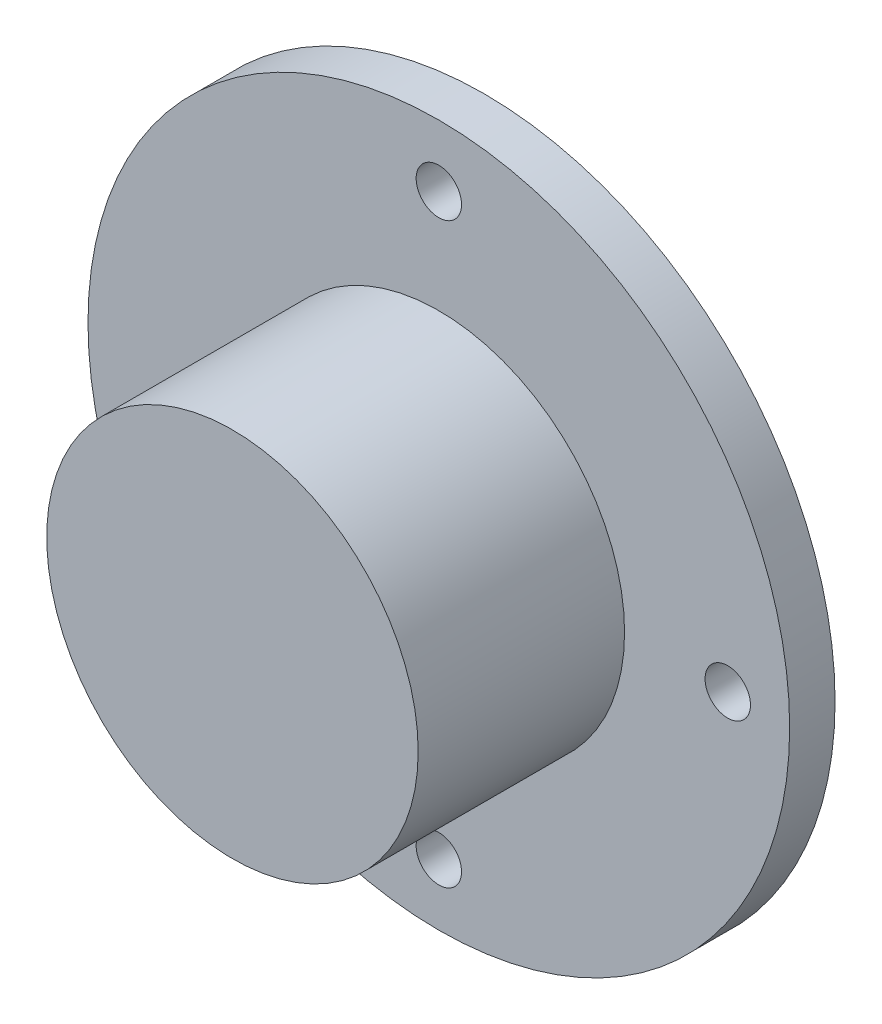
ISO-10303-21;
HEADER;
FILE_DESCRIPTION(('STEP AP214'),'2;1');
FILE_NAME('part.step','',(''),(''),'','','');
FILE_SCHEMA(('AUTOMOTIVE_DESIGN { 1 0 10303 214 1 1 1 1 }'));
ENDSEC;
DATA;
#1=APPLICATION_CONTEXT('core data for automotive mechanical design processes');
#2=APPLICATION_PROTOCOL_DEFINITION('international standard','automotive_design',2000,#1);
#3=PRODUCT_CONTEXT('',#1,'mechanical');
#4=PRODUCT('Part','Part','',(#3));
#5=PRODUCT_RELATED_PRODUCT_CATEGORY('part','',(#4));
#6=PRODUCT_DEFINITION_FORMATION('','',#4);
#7=PRODUCT_DEFINITION_CONTEXT('part definition',#1,'design');
#8=PRODUCT_DEFINITION('design','',#6,#7);
#9=PRODUCT_DEFINITION_SHAPE('','',#8);
#10=(LENGTH_UNIT() NAMED_UNIT(*) SI_UNIT(.MILLI.,.METRE.));
#11=(NAMED_UNIT(*) PLANE_ANGLE_UNIT() SI_UNIT($,.RADIAN.));
#12=(NAMED_UNIT(*) SI_UNIT($,.STERADIAN.) SOLID_ANGLE_UNIT());
#13=UNCERTAINTY_MEASURE_WITH_UNIT(LENGTH_MEASURE(1.E-05),#10,'distance_accuracy_value','');
#14=(GEOMETRIC_REPRESENTATION_CONTEXT(3) GLOBAL_UNCERTAINTY_ASSIGNED_CONTEXT((#13)) GLOBAL_UNIT_ASSIGNED_CONTEXT((#10,
#11,#12)) REPRESENTATION_CONTEXT('',''));
#15=CARTESIAN_POINT('',(0.,0.,0.));
#16=DIRECTION('',(0.,0.,1.));
#17=DIRECTION('',(1.,0.,0.));
#18=AXIS2_PLACEMENT_3D('',#15,#16,#17);
#19=CARTESIAN_POINT('',(0.,0.,2.));
#20=DIRECTION('',(0.,0.,-1.));
#21=DIRECTION('',(-1.,0.,0.));
#22=AXIS2_PLACEMENT_3D('',#19,#20,#21);
#23=CYLINDRICAL_SURFACE('',#22,17.);
#24=CARTESIAN_POINT('',(0.,0.,2.));
#25=DIRECTION('',(0.,0.,1.));
#26=DIRECTION('',(1.,0.,0.));
#27=AXIS2_PLACEMENT_3D('',#24,#25,#26);
#28=CIRCLE('',#27,17.);
#29=CARTESIAN_POINT('',(17.,0.,2.));
#30=VERTEX_POINT('',#29);
#31=EDGE_CURVE('E51',#30,#30,#28,.T.);
#32=ORIENTED_EDGE('',*,*,#31,.F.);
#33=EDGE_LOOP('',(#32));
#34=FACE_BOUND('',#33,.T.);
#35=CARTESIAN_POINT('',(0.,0.,-0.2));
#36=DIRECTION('',(0.,0.,1.));
#37=DIRECTION('',(1.,0.,0.));
#38=AXIS2_PLACEMENT_3D('',#35,#36,#37);
#39=CIRCLE('',#38,17.);
#40=CARTESIAN_POINT('',(17.,0.,-0.2));
#41=VERTEX_POINT('',#40);
#42=EDGE_CURVE('E60',#41,#41,#39,.T.);
#43=ORIENTED_EDGE('',*,*,#42,.T.);
#44=EDGE_LOOP('',(#43));
#45=FACE_BOUND('',#44,.T.);
#46=ADVANCED_FACE('F43',(#34,#45),#23,.T.);
#47=CARTESIAN_POINT('',(0.,0.,2.));
#48=DIRECTION('',(0.,0.,1.));
#49=DIRECTION('',(1.,0.,0.));
#50=AXIS2_PLACEMENT_3D('',#47,#48,#49);
#51=PLANE('',#50);
#52=CARTESIAN_POINT('',(14.,0.,2.));
#53=DIRECTION('',(0.,0.,1.));
#54=DIRECTION('',(1.,0.,0.));
#55=AXIS2_PLACEMENT_3D('',#52,#53,#54);
#56=CIRCLE('',#55,1.1);
#57=CARTESIAN_POINT('',(15.1,0.,2.));
#58=VERTEX_POINT('',#57);
#59=EDGE_CURVE('E91',#58,#58,#56,.F.);
#60=ORIENTED_EDGE('',*,*,#59,.T.);
#61=EDGE_LOOP('',(#60));
#62=FACE_BOUND('',#61,.T.);
#63=CARTESIAN_POINT('',(0.,-14.,2.));
#64=DIRECTION('',(0.,0.,1.));
#65=DIRECTION('',(1.,0.,0.));
#66=AXIS2_PLACEMENT_3D('',#63,#64,#65);
#67=CIRCLE('',#66,1.1);
#68=CARTESIAN_POINT('',(1.1,-14.,2.));
#69=VERTEX_POINT('',#68);
#70=EDGE_CURVE('E83',#69,#69,#67,.F.);
#71=ORIENTED_EDGE('',*,*,#70,.T.);
#72=EDGE_LOOP('',(#71));
#73=FACE_BOUND('',#72,.T.);
#74=CARTESIAN_POINT('',(0.,14.,2.));
#75=DIRECTION('',(0.,0.,1.));
#76=DIRECTION('',(1.,0.,0.));
#77=AXIS2_PLACEMENT_3D('',#74,#75,#76);
#78=CIRCLE('',#77,1.1);
#79=CARTESIAN_POINT('',(1.1,14.,2.));
#80=VERTEX_POINT('',#79);
#81=EDGE_CURVE('E80',#80,#80,#78,.F.);
#82=ORIENTED_EDGE('',*,*,#81,.T.);
#83=EDGE_LOOP('',(#82));
#84=FACE_BOUND('',#83,.T.);
#85=CARTESIAN_POINT('',(0.,0.,2.));
#86=DIRECTION('',(0.,0.,1.));
#87=DIRECTION('',(1.,0.,0.));
#88=AXIS2_PLACEMENT_3D('',#85,#86,#87);
#89=CIRCLE('',#88,9.);
#90=CARTESIAN_POINT('',(9.,0.,2.));
#91=VERTEX_POINT('',#90);
#92=EDGE_CURVE('E70',#91,#91,#89,.F.);
#93=ORIENTED_EDGE('',*,*,#92,.T.);
#94=EDGE_LOOP('',(#93));
#95=FACE_BOUND('',#94,.T.);
#96=ORIENTED_EDGE('',*,*,#31,.T.);
#97=EDGE_LOOP('',(#96));
#98=FACE_BOUND('',#97,.T.);
#99=ADVANCED_FACE('F127',(#62,#73,#84,#95,#98),#51,.T.);
#100=CARTESIAN_POINT('',(0.,0.,-0.2));
#101=DIRECTION('',(0.,0.,1.));
#102=DIRECTION('',(1.,0.,0.));
#103=AXIS2_PLACEMENT_3D('',#100,#101,#102);
#104=PLANE('',#103);
#105=CARTESIAN_POINT('',(14.,0.,-0.200000000000001));
#106=DIRECTION('',(0.,0.,1.));
#107=DIRECTION('',(1.,0.,0.));
#108=AXIS2_PLACEMENT_3D('',#105,#106,#107);
#109=CIRCLE('',#108,1.1);
#110=CARTESIAN_POINT('',(15.1,0.,-0.200000000000001));
#111=VERTEX_POINT('',#110);
#112=EDGE_CURVE('E46',#111,#111,#109,.F.);
#113=ORIENTED_EDGE('',*,*,#112,.F.);
#114=EDGE_LOOP('',(#113));
#115=FACE_BOUND('',#114,.T.);
#116=CARTESIAN_POINT('',(0.,-14.,-0.200000000000001));
#117=DIRECTION('',(0.,0.,1.));
#118=DIRECTION('',(1.,0.,0.));
#119=AXIS2_PLACEMENT_3D('',#116,#117,#118);
#120=CIRCLE('',#119,1.1);
#121=CARTESIAN_POINT('',(1.1,-14.,-0.200000000000001));
#122=VERTEX_POINT('',#121);
#123=EDGE_CURVE('E76',#122,#122,#120,.F.);
#124=ORIENTED_EDGE('',*,*,#123,.F.);
#125=EDGE_LOOP('',(#124));
#126=FACE_BOUND('',#125,.T.);
#127=CARTESIAN_POINT('',(0.,14.,-0.200000000000001));
#128=DIRECTION('',(0.,0.,1.));
#129=DIRECTION('',(1.,0.,0.));
#130=AXIS2_PLACEMENT_3D('',#127,#128,#129);
#131=CIRCLE('',#130,1.1);
#132=CARTESIAN_POINT('',(1.1,14.,-0.200000000000001));
#133=VERTEX_POINT('',#132);
#134=EDGE_CURVE('E74',#133,#133,#131,.F.);
#135=ORIENTED_EDGE('',*,*,#134,.F.);
#136=EDGE_LOOP('',(#135));
#137=FACE_BOUND('',#136,.T.);
#138=ORIENTED_EDGE('',*,*,#42,.F.);
#139=EDGE_LOOP('',(#138));
#140=FACE_BOUND('',#139,.T.);
#141=CARTESIAN_POINT('',(0.,0.,-0.2));
#142=DIRECTION('',(0.,0.,1.));
#143=DIRECTION('',(1.,0.,0.));
#144=AXIS2_PLACEMENT_3D('',#141,#142,#143);
#145=CIRCLE('',#144,11.2);
#146=CARTESIAN_POINT('',(11.2,0.,-0.2));
#147=VERTEX_POINT('',#146);
#148=EDGE_CURVE('E61',#147,#147,#145,.T.);
#149=ORIENTED_EDGE('',*,*,#148,.T.);
#150=EDGE_LOOP('',(#149));
#151=FACE_BOUND('',#150,.T.);
#152=ADVANCED_FACE('F135',(#115,#126,#137,#140,#151),#104,.F.);
#153=CARTESIAN_POINT('',(0.,0.,0.));
#154=DIRECTION('',(0.,0.,-1.));
#155=DIRECTION('',(-1.,0.,0.));
#156=AXIS2_PLACEMENT_3D('',#153,#154,#155);
#157=CYLINDRICAL_SURFACE('',#156,11.2);
#158=CARTESIAN_POINT('',(0.,0.,0.));
#159=DIRECTION('',(0.,0.,1.));
#160=DIRECTION('',(1.,0.,0.));
#161=AXIS2_PLACEMENT_3D('',#158,#159,#160);
#162=CIRCLE('',#161,11.2);
#163=CARTESIAN_POINT('',(11.2,0.,0.));
#164=VERTEX_POINT('',#163);
#165=EDGE_CURVE('E10',#164,#164,#162,.T.);
#166=ORIENTED_EDGE('',*,*,#165,.T.);
#167=EDGE_LOOP('',(#166));
#168=FACE_BOUND('',#167,.T.);
#169=ORIENTED_EDGE('',*,*,#148,.F.);
#170=EDGE_LOOP('',(#169));
#171=FACE_BOUND('',#170,.T.);
#172=ADVANCED_FACE('F143',(#168,#171),#157,.F.);
#173=CARTESIAN_POINT('',(0.,0.,0.));
#174=DIRECTION('',(0.,0.,1.));
#175=DIRECTION('',(1.,0.,0.));
#176=AXIS2_PLACEMENT_3D('',#173,#174,#175);
#177=PLANE('',#176);
#178=CARTESIAN_POINT('',(0.,0.,0.));
#179=DIRECTION('',(0.,0.,1.));
#180=DIRECTION('',(1.,0.,0.));
#181=AXIS2_PLACEMENT_3D('',#178,#179,#180);
#182=CIRCLE('',#181,7.);
#183=CARTESIAN_POINT('',(7.,0.,0.));
#184=VERTEX_POINT('',#183);
#185=EDGE_CURVE('E100',#184,#184,#182,.T.);
#186=ORIENTED_EDGE('',*,*,#185,.T.);
#187=EDGE_LOOP('',(#186));
#188=FACE_BOUND('',#187,.T.);
#189=ORIENTED_EDGE('',*,*,#165,.F.);
#190=EDGE_LOOP('',(#189));
#191=FACE_BOUND('',#190,.T.);
#192=ADVANCED_FACE('F104',(#188,#191),#177,.F.);
#193=CARTESIAN_POINT('',(0.,0.,12.));
#194=DIRECTION('',(0.,0.,-1.));
#195=DIRECTION('',(-1.,0.,0.));
#196=AXIS2_PLACEMENT_3D('',#193,#194,#195);
#197=CYLINDRICAL_SURFACE('',#196,9.);
#198=ORIENTED_EDGE('',*,*,#92,.F.);
#199=EDGE_LOOP('',(#198));
#200=FACE_BOUND('',#199,.T.);
#201=CARTESIAN_POINT('',(0.,0.,12.));
#202=DIRECTION('',(0.,0.,1.));
#203=DIRECTION('',(1.,0.,0.));
#204=AXIS2_PLACEMENT_3D('',#201,#202,#203);
#205=CIRCLE('',#204,9.);
#206=CARTESIAN_POINT('',(9.,0.,12.));
#207=VERTEX_POINT('',#206);
#208=EDGE_CURVE('E63',#207,#207,#205,.T.);
#209=ORIENTED_EDGE('',*,*,#208,.F.);
#210=EDGE_LOOP('',(#209));
#211=FACE_BOUND('',#210,.T.);
#212=ADVANCED_FACE('F125',(#200,#211),#197,.T.);
#213=CARTESIAN_POINT('',(0.,0.,12.));
#214=DIRECTION('',(0.,0.,1.));
#215=DIRECTION('',(1.,0.,0.));
#216=AXIS2_PLACEMENT_3D('',#213,#214,#215);
#217=PLANE('',#216);
#218=ORIENTED_EDGE('',*,*,#208,.T.);
#219=EDGE_LOOP('',(#218));
#220=FACE_BOUND('',#219,.T.);
#221=ADVANCED_FACE('F112',(#220),#217,.T.);
#222=CARTESIAN_POINT('',(0.,0.,9.));
#223=DIRECTION('',(0.,0.,-1.));
#224=DIRECTION('',(-1.,0.,0.));
#225=AXIS2_PLACEMENT_3D('',#222,#223,#224);
#226=CYLINDRICAL_SURFACE('',#225,7.);
#227=CARTESIAN_POINT('',(0.,0.,9.));
#228=DIRECTION('',(0.,0.,1.));
#229=DIRECTION('',(1.,0.,0.));
#230=AXIS2_PLACEMENT_3D('',#227,#228,#229);
#231=CIRCLE('',#230,7.);
#232=CARTESIAN_POINT('',(7.,0.,9.));
#233=VERTEX_POINT('',#232);
#234=EDGE_CURVE('E98',#233,#233,#231,.T.);
#235=ORIENTED_EDGE('',*,*,#234,.T.);
#236=EDGE_LOOP('',(#235));
#237=FACE_BOUND('',#236,.T.);
#238=ORIENTED_EDGE('',*,*,#185,.F.);
#239=EDGE_LOOP('',(#238));
#240=FACE_BOUND('',#239,.T.);
#241=ADVANCED_FACE('F107',(#237,#240),#226,.F.);
#242=CARTESIAN_POINT('',(0.,0.,9.));
#243=DIRECTION('',(0.,0.,1.));
#244=DIRECTION('',(1.,0.,0.));
#245=AXIS2_PLACEMENT_3D('',#242,#243,#244);
#246=PLANE('',#245);
#247=ORIENTED_EDGE('',*,*,#234,.F.);
#248=EDGE_LOOP('',(#247));
#249=FACE_BOUND('',#248,.T.);
#250=ADVANCED_FACE('F109',(#249),#246,.F.);
#251=CARTESIAN_POINT('',(0.,14.,12.));
#252=DIRECTION('',(0.,0.,-1.));
#253=DIRECTION('',(-1.,0.,0.));
#254=AXIS2_PLACEMENT_3D('',#251,#252,#253);
#255=CYLINDRICAL_SURFACE('',#254,1.1);
#256=ORIENTED_EDGE('',*,*,#81,.F.);
#257=EDGE_LOOP('',(#256));
#258=FACE_BOUND('',#257,.T.);
#259=ORIENTED_EDGE('',*,*,#134,.T.);
#260=EDGE_LOOP('',(#259));
#261=FACE_BOUND('',#260,.T.);
#262=ADVANCED_FACE('F116',(#258,#261),#255,.F.);
#263=CARTESIAN_POINT('',(0.,-14.,12.));
#264=DIRECTION('',(0.,0.,-1.));
#265=DIRECTION('',(-1.,0.,0.));
#266=AXIS2_PLACEMENT_3D('',#263,#264,#265);
#267=CYLINDRICAL_SURFACE('',#266,1.1);
#268=ORIENTED_EDGE('',*,*,#70,.F.);
#269=EDGE_LOOP('',(#268));
#270=FACE_BOUND('',#269,.T.);
#271=ORIENTED_EDGE('',*,*,#123,.T.);
#272=EDGE_LOOP('',(#271));
#273=FACE_BOUND('',#272,.T.);
#274=ADVANCED_FACE('F204',(#270,#273),#267,.F.);
#275=CARTESIAN_POINT('',(14.,0.,12.));
#276=DIRECTION('',(0.,0.,-1.));
#277=DIRECTION('',(-1.,0.,0.));
#278=AXIS2_PLACEMENT_3D('',#275,#276,#277);
#279=CYLINDRICAL_SURFACE('',#278,1.1);
#280=ORIENTED_EDGE('',*,*,#59,.F.);
#281=EDGE_LOOP('',(#280));
#282=FACE_BOUND('',#281,.T.);
#283=ORIENTED_EDGE('',*,*,#112,.T.);
#284=EDGE_LOOP('',(#283));
#285=FACE_BOUND('',#284,.T.);
#286=ADVANCED_FACE('F213',(#282,#285),#279,.F.);
#287=CLOSED_SHELL('',(#46,#99,#152,#172,#192,#212,#221,#241,#250,#262,#274,#286));
#288=MANIFOLD_SOLID_BREP('B2',#287);
#289=ADVANCED_BREP_SHAPE_REPRESENTATION('',(#18,#288),#14);
#290=SHAPE_DEFINITION_REPRESENTATION(#9,#289);
ENDSEC;
END-ISO-10303-21;
